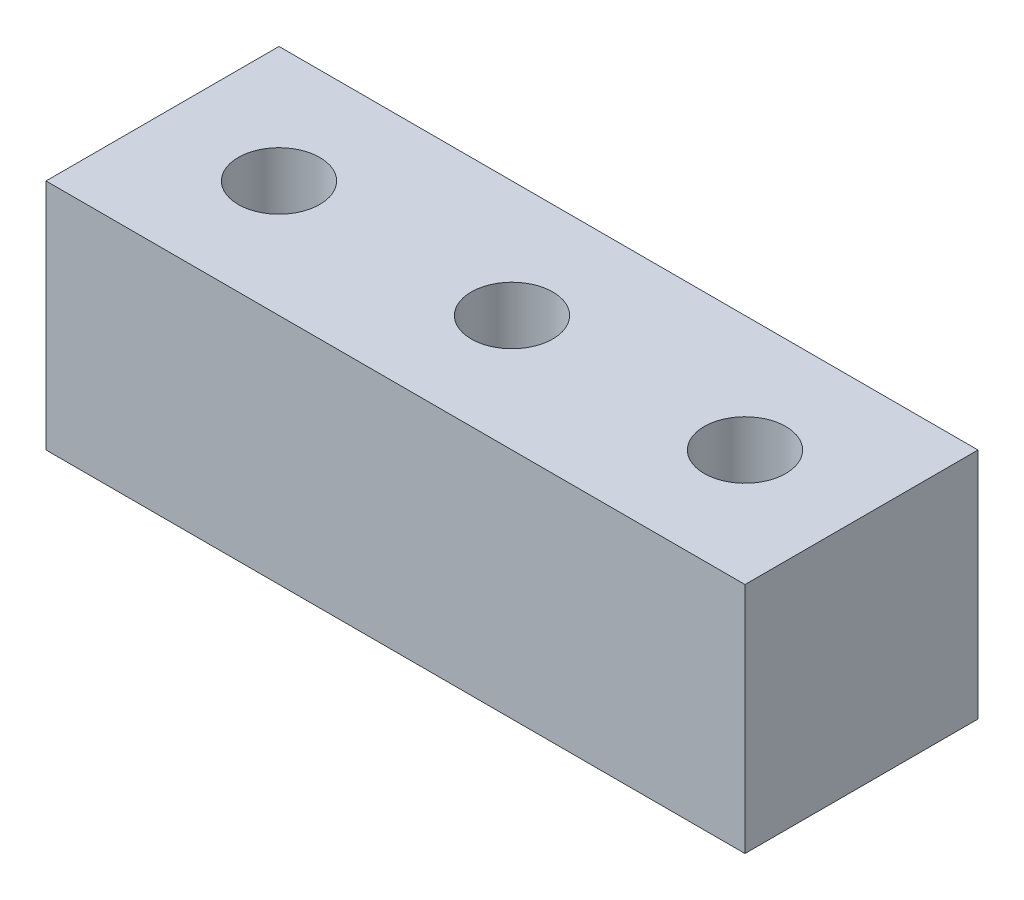
ISO-10303-21;
HEADER;
FILE_DESCRIPTION(('STEP AP214'),'2;1');
FILE_NAME('part.step','',(''),(''),'','','');
FILE_SCHEMA(('AUTOMOTIVE_DESIGN { 1 0 10303 214 1 1 1 1 }'));
ENDSEC;
DATA;
#1=APPLICATION_CONTEXT('core data for automotive mechanical design processes');
#2=APPLICATION_PROTOCOL_DEFINITION('international standard','automotive_design',2000,#1);
#3=PRODUCT_CONTEXT('',#1,'mechanical');
#4=PRODUCT('Part','Part','',(#3));
#5=PRODUCT_RELATED_PRODUCT_CATEGORY('part','',(#4));
#6=PRODUCT_DEFINITION_FORMATION('','',#4);
#7=PRODUCT_DEFINITION_CONTEXT('part definition',#1,'design');
#8=PRODUCT_DEFINITION('design','',#6,#7);
#9=PRODUCT_DEFINITION_SHAPE('','',#8);
#10=(LENGTH_UNIT() NAMED_UNIT(*) SI_UNIT(.MILLI.,.METRE.));
#11=(NAMED_UNIT(*) PLANE_ANGLE_UNIT() SI_UNIT($,.RADIAN.));
#12=(NAMED_UNIT(*) SI_UNIT($,.STERADIAN.) SOLID_ANGLE_UNIT());
#13=UNCERTAINTY_MEASURE_WITH_UNIT(LENGTH_MEASURE(1.E-05),#10,'distance_accuracy_value','');
#14=(GEOMETRIC_REPRESENTATION_CONTEXT(3) GLOBAL_UNCERTAINTY_ASSIGNED_CONTEXT((#13)) GLOBAL_UNIT_ASSIGNED_CONTEXT((#10,
#11,#12)) REPRESENTATION_CONTEXT('',''));
#15=CARTESIAN_POINT('',(0.,0.,0.));
#16=DIRECTION('',(0.,0.,1.));
#17=DIRECTION('',(1.,0.,0.));
#18=AXIS2_PLACEMENT_3D('',#15,#16,#17);
#19=CARTESIAN_POINT('',(0.,12.,0.));
#20=DIRECTION('',(0.,1.,0.));
#21=DIRECTION('',(0.,0.,1.));
#22=AXIS2_PLACEMENT_3D('',#19,#20,#21);
#23=PLANE('',#22);
#24=CARTESIAN_POINT('',(-12.,12.,0.));
#25=DIRECTION('',(0.,1.,0.));
#26=DIRECTION('',(0.,0.,1.));
#27=AXIS2_PLACEMENT_3D('',#24,#25,#26);
#28=CIRCLE('',#27,2.1);
#29=CARTESIAN_POINT('',(-12.,12.,2.1));
#30=VERTEX_POINT('',#29);
#31=EDGE_CURVE('E128',#30,#30,#28,.T.);
#32=ORIENTED_EDGE('',*,*,#31,.F.);
#33=EDGE_LOOP('',(#32));
#34=FACE_BOUND('',#33,.T.);
#35=DIRECTION('',(0.,0.,1.));
#36=VECTOR('',#35,1.);
#37=CARTESIAN_POINT('',(-18.,12.,6.));
#38=LINE('',#37,#36);
#39=CARTESIAN_POINT('',(-18.,12.,-6.));
#40=VERTEX_POINT('',#39);
#41=CARTESIAN_POINT('',(-18.,12.,6.));
#42=VERTEX_POINT('',#41);
#43=EDGE_CURVE('E88',#40,#42,#38,.T.);
#44=ORIENTED_EDGE('',*,*,#43,.T.);
#45=DIRECTION('',(1.,0.,0.));
#46=VECTOR('',#45,1.);
#47=CARTESIAN_POINT('',(18.,12.,6.));
#48=LINE('',#47,#46);
#49=CARTESIAN_POINT('',(18.,12.,6.));
#50=VERTEX_POINT('',#49);
#51=EDGE_CURVE('E83',#42,#50,#48,.T.);
#52=ORIENTED_EDGE('',*,*,#51,.T.);
#53=DIRECTION('',(0.,0.,-1.));
#54=VECTOR('',#53,1.);
#55=CARTESIAN_POINT('',(18.,12.,6.));
#56=LINE('',#55,#54);
#57=CARTESIAN_POINT('',(18.,12.,-6.));
#58=VERTEX_POINT('',#57);
#59=EDGE_CURVE('E86',#50,#58,#56,.T.);
#60=ORIENTED_EDGE('',*,*,#59,.T.);
#61=DIRECTION('',(-1.,0.,0.));
#62=VECTOR('',#61,1.);
#63=CARTESIAN_POINT('',(18.,12.,-6.));
#64=LINE('',#63,#62);
#65=EDGE_CURVE('E52',#58,#40,#64,.T.);
#66=ORIENTED_EDGE('',*,*,#65,.T.);
#67=EDGE_LOOP('',(#44,#52,#60,#66));
#68=FACE_BOUND('',#67,.T.);
#69=CARTESIAN_POINT('',(0.,12.,0.));
#70=DIRECTION('',(0.,1.,0.));
#71=DIRECTION('',(0.,0.,1.));
#72=AXIS2_PLACEMENT_3D('',#69,#70,#71);
#73=CIRCLE('',#72,2.1);
#74=CARTESIAN_POINT('',(0.,12.,2.1));
#75=VERTEX_POINT('',#74);
#76=EDGE_CURVE('E106',#75,#75,#73,.T.);
#77=ORIENTED_EDGE('',*,*,#76,.F.);
#78=EDGE_LOOP('',(#77));
#79=FACE_BOUND('',#78,.T.);
#80=CARTESIAN_POINT('',(12.,12.,0.));
#81=DIRECTION('',(0.,1.,0.));
#82=DIRECTION('',(0.,0.,1.));
#83=AXIS2_PLACEMENT_3D('',#80,#81,#82);
#84=CIRCLE('',#83,2.1);
#85=CARTESIAN_POINT('',(12.,12.,2.1));
#86=VERTEX_POINT('',#85);
#87=EDGE_CURVE('E131',#86,#86,#84,.T.);
#88=ORIENTED_EDGE('',*,*,#87,.F.);
#89=EDGE_LOOP('',(#88));
#90=FACE_BOUND('',#89,.T.);
#91=ADVANCED_FACE('F35',(#34,#68,#79,#90),#23,.T.);
#92=CARTESIAN_POINT('',(0.,0.,0.));
#93=DIRECTION('',(0.,1.,0.));
#94=DIRECTION('',(0.,0.,1.));
#95=AXIS2_PLACEMENT_3D('',#92,#93,#94);
#96=PLANE('',#95);
#97=DIRECTION('',(0.,0.,1.));
#98=VECTOR('',#97,1.);
#99=CARTESIAN_POINT('',(-18.,0.,6.));
#100=LINE('',#99,#98);
#101=CARTESIAN_POINT('',(-18.,0.,-6.));
#102=VERTEX_POINT('',#101);
#103=CARTESIAN_POINT('',(-18.,0.,6.));
#104=VERTEX_POINT('',#103);
#105=EDGE_CURVE('E103',#102,#104,#100,.T.);
#106=ORIENTED_EDGE('',*,*,#105,.F.);
#107=DIRECTION('',(-1.,0.,0.));
#108=VECTOR('',#107,1.);
#109=CARTESIAN_POINT('',(18.,0.,-6.));
#110=LINE('',#109,#108);
#111=CARTESIAN_POINT('',(18.,0.,-6.));
#112=VERTEX_POINT('',#111);
#113=EDGE_CURVE('E75',#112,#102,#110,.T.);
#114=ORIENTED_EDGE('',*,*,#113,.F.);
#115=DIRECTION('',(0.,0.,-1.));
#116=VECTOR('',#115,1.);
#117=CARTESIAN_POINT('',(18.,0.,6.));
#118=LINE('',#117,#116);
#119=CARTESIAN_POINT('',(18.,0.,6.));
#120=VERTEX_POINT('',#119);
#121=EDGE_CURVE('E69',#120,#112,#118,.T.);
#122=ORIENTED_EDGE('',*,*,#121,.F.);
#123=DIRECTION('',(1.,0.,0.));
#124=VECTOR('',#123,1.);
#125=CARTESIAN_POINT('',(18.,0.,6.));
#126=LINE('',#125,#124);
#127=EDGE_CURVE('E93',#104,#120,#126,.T.);
#128=ORIENTED_EDGE('',*,*,#127,.F.);
#129=EDGE_LOOP('',(#106,#114,#122,#128));
#130=FACE_BOUND('',#129,.T.);
#131=ADVANCED_FACE('F140',(#130),#96,.F.);
#132=CARTESIAN_POINT('',(-18.,12.,6.));
#133=DIRECTION('',(1.,0.,0.));
#134=DIRECTION('',(0.,0.,-1.));
#135=AXIS2_PLACEMENT_3D('',#132,#133,#134);
#136=PLANE('',#135);
#137=ORIENTED_EDGE('',*,*,#105,.T.);
#138=DIRECTION('',(0.,-1.,0.));
#139=VECTOR('',#138,1.);
#140=CARTESIAN_POINT('',(-18.,12.,6.));
#141=LINE('',#140,#139);
#142=EDGE_CURVE('E94',#42,#104,#141,.T.);
#143=ORIENTED_EDGE('',*,*,#142,.F.);
#144=ORIENTED_EDGE('',*,*,#43,.F.);
#145=DIRECTION('',(0.,-1.,0.));
#146=VECTOR('',#145,1.);
#147=CARTESIAN_POINT('',(-18.,12.,-6.));
#148=LINE('',#147,#146);
#149=EDGE_CURVE('E99',#40,#102,#148,.T.);
#150=ORIENTED_EDGE('',*,*,#149,.T.);
#151=EDGE_LOOP('',(#137,#143,#144,#150));
#152=FACE_BOUND('',#151,.T.);
#153=ADVANCED_FACE('F37',(#152),#136,.F.);
#154=CARTESIAN_POINT('',(18.,12.,6.));
#155=DIRECTION('',(0.,0.,-1.));
#156=DIRECTION('',(-1.,0.,0.));
#157=AXIS2_PLACEMENT_3D('',#154,#155,#156);
#158=PLANE('',#157);
#159=ORIENTED_EDGE('',*,*,#127,.T.);
#160=DIRECTION('',(0.,-1.,0.));
#161=VECTOR('',#160,1.);
#162=CARTESIAN_POINT('',(18.,12.,6.));
#163=LINE('',#162,#161);
#164=EDGE_CURVE('E91',#50,#120,#163,.T.);
#165=ORIENTED_EDGE('',*,*,#164,.F.);
#166=ORIENTED_EDGE('',*,*,#51,.F.);
#167=ORIENTED_EDGE('',*,*,#142,.T.);
#168=EDGE_LOOP('',(#159,#165,#166,#167));
#169=FACE_BOUND('',#168,.T.);
#170=ADVANCED_FACE('F92',(#169),#158,.F.);
#171=CARTESIAN_POINT('',(18.,12.,6.));
#172=DIRECTION('',(-1.,0.,0.));
#173=DIRECTION('',(0.,0.,1.));
#174=AXIS2_PLACEMENT_3D('',#171,#172,#173);
#175=PLANE('',#174);
#176=ORIENTED_EDGE('',*,*,#121,.T.);
#177=DIRECTION('',(0.,-1.,0.));
#178=VECTOR('',#177,1.);
#179=CARTESIAN_POINT('',(18.,12.,-6.));
#180=LINE('',#179,#178);
#181=EDGE_CURVE('E95',#58,#112,#180,.T.);
#182=ORIENTED_EDGE('',*,*,#181,.F.);
#183=ORIENTED_EDGE('',*,*,#59,.F.);
#184=ORIENTED_EDGE('',*,*,#164,.T.);
#185=EDGE_LOOP('',(#176,#182,#183,#184));
#186=FACE_BOUND('',#185,.T.);
#187=ADVANCED_FACE('F97',(#186),#175,.F.);
#188=CARTESIAN_POINT('',(18.,12.,-6.));
#189=DIRECTION('',(0.,0.,1.));
#190=DIRECTION('',(1.,0.,0.));
#191=AXIS2_PLACEMENT_3D('',#188,#189,#190);
#192=PLANE('',#191);
#193=ORIENTED_EDGE('',*,*,#113,.T.);
#194=ORIENTED_EDGE('',*,*,#149,.F.);
#195=ORIENTED_EDGE('',*,*,#65,.F.);
#196=ORIENTED_EDGE('',*,*,#181,.T.);
#197=EDGE_LOOP('',(#193,#194,#195,#196));
#198=FACE_BOUND('',#197,.T.);
#199=ADVANCED_FACE('F124',(#198),#192,.F.);
#200=CARTESIAN_POINT('',(0.,12.,0.));
#201=DIRECTION('',(0.,-1.,0.));
#202=DIRECTION('',(0.,0.,-1.));
#203=AXIS2_PLACEMENT_3D('',#200,#201,#202);
#204=CYLINDRICAL_SURFACE('',#203,2.1);
#205=CARTESIAN_POINT('',(0.,2.,0.));
#206=DIRECTION('',(0.,1.,0.));
#207=DIRECTION('',(0.,0.,1.));
#208=AXIS2_PLACEMENT_3D('',#205,#206,#207);
#209=CIRCLE('',#208,2.1);
#210=CARTESIAN_POINT('',(0.,2.,2.1));
#211=VERTEX_POINT('',#210);
#212=EDGE_CURVE('E44',#211,#211,#209,.T.);
#213=ORIENTED_EDGE('',*,*,#212,.F.);
#214=EDGE_LOOP('',(#213));
#215=FACE_BOUND('',#214,.T.);
#216=ORIENTED_EDGE('',*,*,#76,.T.);
#217=EDGE_LOOP('',(#216));
#218=FACE_BOUND('',#217,.T.);
#219=ADVANCED_FACE('F120',(#215,#218),#204,.F.);
#220=CARTESIAN_POINT('',(-12.,12.,0.));
#221=DIRECTION('',(0.,-1.,0.));
#222=DIRECTION('',(0.,0.,-1.));
#223=AXIS2_PLACEMENT_3D('',#220,#221,#222);
#224=CYLINDRICAL_SURFACE('',#223,2.1);
#225=CARTESIAN_POINT('',(-12.,2.,0.));
#226=DIRECTION('',(0.,1.,0.));
#227=DIRECTION('',(0.,0.,1.));
#228=AXIS2_PLACEMENT_3D('',#225,#226,#227);
#229=CIRCLE('',#228,2.1);
#230=CARTESIAN_POINT('',(-12.,2.,2.1));
#231=VERTEX_POINT('',#230);
#232=EDGE_CURVE('E113',#231,#231,#229,.T.);
#233=ORIENTED_EDGE('',*,*,#232,.F.);
#234=EDGE_LOOP('',(#233));
#235=FACE_BOUND('',#234,.T.);
#236=ORIENTED_EDGE('',*,*,#31,.T.);
#237=EDGE_LOOP('',(#236));
#238=FACE_BOUND('',#237,.T.);
#239=ADVANCED_FACE('F123',(#235,#238),#224,.F.);
#240=CARTESIAN_POINT('',(12.,12.,0.));
#241=DIRECTION('',(0.,-1.,0.));
#242=DIRECTION('',(0.,0.,-1.));
#243=AXIS2_PLACEMENT_3D('',#240,#241,#242);
#244=CYLINDRICAL_SURFACE('',#243,2.1);
#245=CARTESIAN_POINT('',(12.,2.,0.));
#246=DIRECTION('',(0.,1.,0.));
#247=DIRECTION('',(0.,0.,1.));
#248=AXIS2_PLACEMENT_3D('',#245,#246,#247);
#249=CIRCLE('',#248,2.1);
#250=CARTESIAN_POINT('',(12.,2.,2.1));
#251=VERTEX_POINT('',#250);
#252=EDGE_CURVE('E11',#251,#251,#249,.T.);
#253=ORIENTED_EDGE('',*,*,#252,.F.);
#254=EDGE_LOOP('',(#253));
#255=FACE_BOUND('',#254,.T.);
#256=ORIENTED_EDGE('',*,*,#87,.T.);
#257=EDGE_LOOP('',(#256));
#258=FACE_BOUND('',#257,.T.);
#259=ADVANCED_FACE('F137',(#255,#258),#244,.F.);
#260=CARTESIAN_POINT('',(0.,2.,0.));
#261=DIRECTION('',(0.,1.,0.));
#262=DIRECTION('',(0.,0.,1.));
#263=AXIS2_PLACEMENT_3D('',#260,#261,#262);
#264=PLANE('',#263);
#265=ORIENTED_EDGE('',*,*,#232,.T.);
#266=EDGE_LOOP('',(#265));
#267=FACE_BOUND('',#266,.T.);
#268=ADVANCED_FACE('F195',(#267),#264,.T.);
#269=CARTESIAN_POINT('',(0.,2.,0.));
#270=DIRECTION('',(0.,1.,0.));
#271=DIRECTION('',(0.,0.,1.));
#272=AXIS2_PLACEMENT_3D('',#269,#270,#271);
#273=PLANE('',#272);
#274=ORIENTED_EDGE('',*,*,#212,.T.);
#275=EDGE_LOOP('',(#274));
#276=FACE_BOUND('',#275,.T.);
#277=ADVANCED_FACE('F118',(#276),#273,.T.);
#278=CARTESIAN_POINT('',(0.,2.,0.));
#279=DIRECTION('',(0.,1.,0.));
#280=DIRECTION('',(0.,0.,1.));
#281=AXIS2_PLACEMENT_3D('',#278,#279,#280);
#282=PLANE('',#281);
#283=ORIENTED_EDGE('',*,*,#252,.T.);
#284=EDGE_LOOP('',(#283));
#285=FACE_BOUND('',#284,.T.);
#286=ADVANCED_FACE('F214',(#285),#282,.T.);
#287=CLOSED_SHELL('',(#91,#131,#153,#170,#187,#199,#219,#239,#259,#268,#277,#286));
#288=MANIFOLD_SOLID_BREP('B2',#287);
#289=ADVANCED_BREP_SHAPE_REPRESENTATION('',(#18,#288),#14);
#290=SHAPE_DEFINITION_REPRESENTATION(#9,#289);
ENDSEC;
END-ISO-10303-21;
